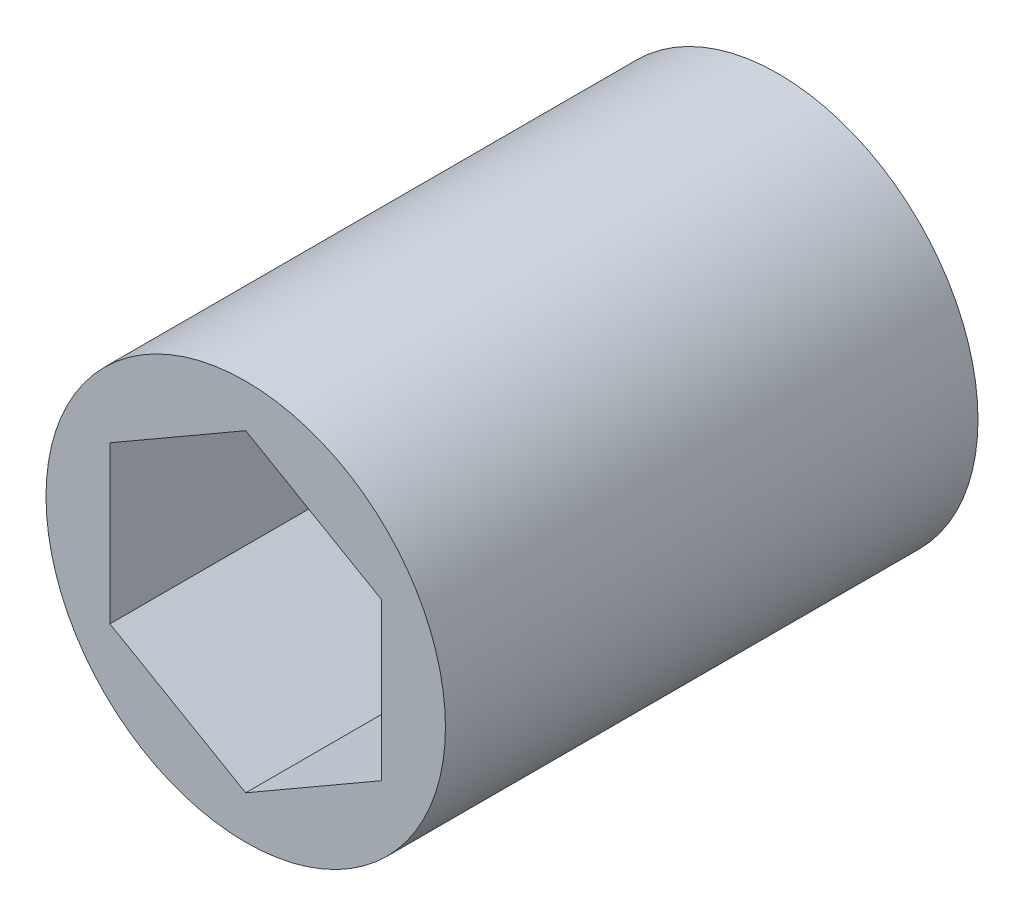
ISO-10303-21;
HEADER;
FILE_DESCRIPTION(('STEP AP214'),'2;1');
FILE_NAME('part.step','',(''),(''),'','','');
FILE_SCHEMA(('AUTOMOTIVE_DESIGN { 1 0 10303 214 1 1 1 1 }'));
ENDSEC;
DATA;
#1=APPLICATION_CONTEXT('core data for automotive mechanical design processes');
#2=APPLICATION_PROTOCOL_DEFINITION('international standard','automotive_design',2000,#1);
#3=PRODUCT_CONTEXT('',#1,'mechanical');
#4=PRODUCT('Part','Part','',(#3));
#5=PRODUCT_RELATED_PRODUCT_CATEGORY('part','',(#4));
#6=PRODUCT_DEFINITION_FORMATION('','',#4);
#7=PRODUCT_DEFINITION_CONTEXT('part definition',#1,'design');
#8=PRODUCT_DEFINITION('design','',#6,#7);
#9=PRODUCT_DEFINITION_SHAPE('','',#8);
#10=(LENGTH_UNIT() NAMED_UNIT(*) SI_UNIT(.MILLI.,.METRE.));
#11=(NAMED_UNIT(*) PLANE_ANGLE_UNIT() SI_UNIT($,.RADIAN.));
#12=(NAMED_UNIT(*) SI_UNIT($,.STERADIAN.) SOLID_ANGLE_UNIT());
#13=UNCERTAINTY_MEASURE_WITH_UNIT(LENGTH_MEASURE(1.E-05),#10,'distance_accuracy_value','');
#14=(GEOMETRIC_REPRESENTATION_CONTEXT(3) GLOBAL_UNCERTAINTY_ASSIGNED_CONTEXT((#13)) GLOBAL_UNIT_ASSIGNED_CONTEXT((#10,
#11,#12)) REPRESENTATION_CONTEXT('',''));
#15=CARTESIAN_POINT('',(0.,0.,0.));
#16=DIRECTION('',(0.,0.,1.));
#17=DIRECTION('',(1.,0.,0.));
#18=AXIS2_PLACEMENT_3D('',#15,#16,#17);
#19=CARTESIAN_POINT('',(0.,0.,12.7));
#20=DIRECTION('',(0.,0.,1.));
#21=DIRECTION('',(1.,0.,0.));
#22=AXIS2_PLACEMENT_3D('',#19,#20,#21);
#23=PLANE('',#22);
#24=CARTESIAN_POINT('',(0.,0.,12.7));
#25=DIRECTION('',(0.,0.,1.));
#26=DIRECTION('',(1.,0.,0.));
#27=AXIS2_PLACEMENT_3D('',#24,#25,#26);
#28=CIRCLE('',#27,9.525);
#29=CARTESIAN_POINT('',(9.525,0.,12.7));
#30=VERTEX_POINT('',#29);
#31=EDGE_CURVE('E11',#30,#30,#28,.T.);
#32=ORIENTED_EDGE('',*,*,#31,.T.);
#33=EDGE_LOOP('',(#32));
#34=FACE_BOUND('',#33,.T.);
#35=DIRECTION('',(-0.866025403784439,-0.5,0.));
#36=VECTOR('',#35,1.);
#37=CARTESIAN_POINT('',(0.,7.47899538708241,12.7));
#38=LINE('',#37,#36);
#39=CARTESIAN_POINT('',(0.,7.47899538708241,12.7));
#40=VERTEX_POINT('',#39);
#41=CARTESIAN_POINT('',(-6.477,3.73949769354121,12.7));
#42=VERTEX_POINT('',#41);
#43=EDGE_CURVE('E108',#40,#42,#38,.T.);
#44=ORIENTED_EDGE('',*,*,#43,.F.);
#45=DIRECTION('',(-0.866025403784439,0.5,0.));
#46=VECTOR('',#45,1.);
#47=CARTESIAN_POINT('',(6.477,3.73949769354121,12.7));
#48=LINE('',#47,#46);
#49=CARTESIAN_POINT('',(6.477,3.73949769354121,12.7));
#50=VERTEX_POINT('',#49);
#51=EDGE_CURVE('E99',#50,#40,#48,.T.);
#52=ORIENTED_EDGE('',*,*,#51,.F.);
#53=DIRECTION('',(0.,1.,0.));
#54=VECTOR('',#53,1.);
#55=CARTESIAN_POINT('',(6.477,-3.73949769354121,12.7));
#56=LINE('',#55,#54);
#57=CARTESIAN_POINT('',(6.477,-3.73949769354121,12.7));
#58=VERTEX_POINT('',#57);
#59=EDGE_CURVE('E133',#58,#50,#56,.T.);
#60=ORIENTED_EDGE('',*,*,#59,.F.);
#61=DIRECTION('',(0.866025403784439,0.5,0.));
#62=VECTOR('',#61,1.);
#63=CARTESIAN_POINT('',(0.,-7.47899538708241,12.7));
#64=LINE('',#63,#62);
#65=CARTESIAN_POINT('',(0.,-7.47899538708241,12.7));
#66=VERTEX_POINT('',#65);
#67=EDGE_CURVE('E130',#66,#58,#64,.T.);
#68=ORIENTED_EDGE('',*,*,#67,.F.);
#69=DIRECTION('',(0.866025403784439,-0.5,0.));
#70=VECTOR('',#69,1.);
#71=CARTESIAN_POINT('',(-6.477,-3.73949769354121,12.7));
#72=LINE('',#71,#70);
#73=CARTESIAN_POINT('',(-6.477,-3.73949769354121,12.7));
#74=VERTEX_POINT('',#73);
#75=EDGE_CURVE('E125',#74,#66,#72,.T.);
#76=ORIENTED_EDGE('',*,*,#75,.F.);
#77=DIRECTION('',(0.,-1.,0.));
#78=VECTOR('',#77,1.);
#79=CARTESIAN_POINT('',(-6.477,3.73949769354121,12.7));
#80=LINE('',#79,#78);
#81=EDGE_CURVE('E121',#42,#74,#80,.T.);
#82=ORIENTED_EDGE('',*,*,#81,.F.);
#83=EDGE_LOOP('',(#44,#52,#60,#68,#76,#82));
#84=FACE_BOUND('',#83,.T.);
#85=ADVANCED_FACE('F45',(#34,#84),#23,.T.);
#86=CARTESIAN_POINT('',(0.,0.,-12.7));
#87=DIRECTION('',(0.,0.,1.));
#88=DIRECTION('',(1.,0.,0.));
#89=AXIS2_PLACEMENT_3D('',#86,#87,#88);
#90=PLANE('',#89);
#91=CARTESIAN_POINT('',(0.,0.,-12.7));
#92=DIRECTION('',(0.,0.,1.));
#93=DIRECTION('',(1.,0.,0.));
#94=AXIS2_PLACEMENT_3D('',#91,#92,#93);
#95=CIRCLE('',#94,9.525);
#96=CARTESIAN_POINT('',(9.525,0.,-12.7));
#97=VERTEX_POINT('',#96);
#98=EDGE_CURVE('E49',#97,#97,#95,.T.);
#99=ORIENTED_EDGE('',*,*,#98,.F.);
#100=EDGE_LOOP('',(#99));
#101=FACE_BOUND('',#100,.T.);
#102=DIRECTION('',(-0.866025403784439,0.5,0.));
#103=VECTOR('',#102,1.);
#104=CARTESIAN_POINT('',(6.477,3.73949769354121,-12.7));
#105=LINE('',#104,#103);
#106=CARTESIAN_POINT('',(6.477,3.73949769354121,-12.7));
#107=VERTEX_POINT('',#106);
#108=CARTESIAN_POINT('',(0.,7.47899538708241,-12.7));
#109=VERTEX_POINT('',#108);
#110=EDGE_CURVE('E69',#107,#109,#105,.T.);
#111=ORIENTED_EDGE('',*,*,#110,.T.);
#112=DIRECTION('',(-0.866025403784439,-0.5,0.));
#113=VECTOR('',#112,1.);
#114=CARTESIAN_POINT('',(0.,7.47899538708241,-12.7));
#115=LINE('',#114,#113);
#116=CARTESIAN_POINT('',(-6.477,3.73949769354121,-12.7));
#117=VERTEX_POINT('',#116);
#118=EDGE_CURVE('E115',#109,#117,#115,.T.);
#119=ORIENTED_EDGE('',*,*,#118,.T.);
#120=DIRECTION('',(0.,-1.,0.));
#121=VECTOR('',#120,1.);
#122=CARTESIAN_POINT('',(-6.477,3.73949769354121,-12.7));
#123=LINE('',#122,#121);
#124=CARTESIAN_POINT('',(-6.477,-3.73949769354121,-12.7));
#125=VERTEX_POINT('',#124);
#126=EDGE_CURVE('E140',#117,#125,#123,.T.);
#127=ORIENTED_EDGE('',*,*,#126,.T.);
#128=DIRECTION('',(0.866025403784439,-0.5,0.));
#129=VECTOR('',#128,1.);
#130=CARTESIAN_POINT('',(-6.477,-3.73949769354121,-12.7));
#131=LINE('',#130,#129);
#132=CARTESIAN_POINT('',(0.,-7.47899538708241,-12.7));
#133=VERTEX_POINT('',#132);
#134=EDGE_CURVE('E144',#125,#133,#131,.T.);
#135=ORIENTED_EDGE('',*,*,#134,.T.);
#136=DIRECTION('',(0.866025403784439,0.5,0.));
#137=VECTOR('',#136,1.);
#138=CARTESIAN_POINT('',(0.,-7.47899538708241,-12.7));
#139=LINE('',#138,#137);
#140=CARTESIAN_POINT('',(6.477,-3.73949769354121,-12.7));
#141=VERTEX_POINT('',#140);
#142=EDGE_CURVE('E148',#133,#141,#139,.T.);
#143=ORIENTED_EDGE('',*,*,#142,.T.);
#144=DIRECTION('',(0.,1.,0.));
#145=VECTOR('',#144,1.);
#146=CARTESIAN_POINT('',(6.477,-3.73949769354121,-12.7));
#147=LINE('',#146,#145);
#148=EDGE_CURVE('E109',#141,#107,#147,.T.);
#149=ORIENTED_EDGE('',*,*,#148,.T.);
#150=EDGE_LOOP('',(#111,#119,#127,#135,#143,#149));
#151=FACE_BOUND('',#150,.T.);
#152=ADVANCED_FACE('F172',(#101,#151),#90,.F.);
#153=CARTESIAN_POINT('',(0.,0.,12.7));
#154=DIRECTION('',(0.,0.,-1.));
#155=DIRECTION('',(-1.,0.,0.));
#156=AXIS2_PLACEMENT_3D('',#153,#154,#155);
#157=CYLINDRICAL_SURFACE('',#156,9.525);
#158=ORIENTED_EDGE('',*,*,#31,.F.);
#159=EDGE_LOOP('',(#158));
#160=FACE_BOUND('',#159,.T.);
#161=ORIENTED_EDGE('',*,*,#98,.T.);
#162=EDGE_LOOP('',(#161));
#163=FACE_BOUND('',#162,.T.);
#164=ADVANCED_FACE('F47',(#160,#163),#157,.T.);
#165=CARTESIAN_POINT('',(6.477,3.73949769354121,12.7));
#166=DIRECTION('',(-0.5,-0.866025403784439,0.));
#167=DIRECTION('',(0.866025403784439,-0.5,0.));
#168=AXIS2_PLACEMENT_3D('',#165,#166,#167);
#169=PLANE('',#168);
#170=ORIENTED_EDGE('',*,*,#110,.F.);
#171=DIRECTION('',(0.,0.,-1.));
#172=VECTOR('',#171,1.);
#173=CARTESIAN_POINT('',(6.477,3.73949769354121,12.7));
#174=LINE('',#173,#172);
#175=EDGE_CURVE('E103',#50,#107,#174,.T.);
#176=ORIENTED_EDGE('',*,*,#175,.F.);
#177=ORIENTED_EDGE('',*,*,#51,.T.);
#178=DIRECTION('',(0.,0.,-1.));
#179=VECTOR('',#178,1.);
#180=CARTESIAN_POINT('',(0.,7.47899538708241,12.7));
#181=LINE('',#180,#179);
#182=EDGE_CURVE('E102',#40,#109,#181,.T.);
#183=ORIENTED_EDGE('',*,*,#182,.T.);
#184=EDGE_LOOP('',(#170,#176,#177,#183));
#185=FACE_BOUND('',#184,.T.);
#186=ADVANCED_FACE('F101',(#185),#169,.T.);
#187=CARTESIAN_POINT('',(0.,7.47899538708241,12.7));
#188=DIRECTION('',(0.5,-0.866025403784439,0.));
#189=DIRECTION('',(0.866025403784439,0.5,0.));
#190=AXIS2_PLACEMENT_3D('',#187,#188,#189);
#191=PLANE('',#190);
#192=ORIENTED_EDGE('',*,*,#118,.F.);
#193=ORIENTED_EDGE('',*,*,#182,.F.);
#194=ORIENTED_EDGE('',*,*,#43,.T.);
#195=DIRECTION('',(0.,0.,-1.));
#196=VECTOR('',#195,1.);
#197=CARTESIAN_POINT('',(-6.477,3.73949769354121,12.7));
#198=LINE('',#197,#196);
#199=EDGE_CURVE('E117',#42,#117,#198,.T.);
#200=ORIENTED_EDGE('',*,*,#199,.T.);
#201=EDGE_LOOP('',(#192,#193,#194,#200));
#202=FACE_BOUND('',#201,.T.);
#203=ADVANCED_FACE('F112',(#202),#191,.T.);
#204=CARTESIAN_POINT('',(-6.477,3.73949769354121,12.7));
#205=DIRECTION('',(1.,0.,0.));
#206=DIRECTION('',(0.,1.,0.));
#207=AXIS2_PLACEMENT_3D('',#204,#205,#206);
#208=PLANE('',#207);
#209=ORIENTED_EDGE('',*,*,#126,.F.);
#210=ORIENTED_EDGE('',*,*,#199,.F.);
#211=ORIENTED_EDGE('',*,*,#81,.T.);
#212=DIRECTION('',(0.,0.,-1.));
#213=VECTOR('',#212,1.);
#214=CARTESIAN_POINT('',(-6.477,-3.73949769354121,12.7));
#215=LINE('',#214,#213);
#216=EDGE_CURVE('E162',#74,#125,#215,.T.);
#217=ORIENTED_EDGE('',*,*,#216,.T.);
#218=EDGE_LOOP('',(#209,#210,#211,#217));
#219=FACE_BOUND('',#218,.T.);
#220=ADVANCED_FACE('F168',(#219),#208,.T.);
#221=CARTESIAN_POINT('',(-6.477,-3.73949769354121,12.7));
#222=DIRECTION('',(0.5,0.866025403784439,0.));
#223=DIRECTION('',(-0.866025403784439,0.5,0.));
#224=AXIS2_PLACEMENT_3D('',#221,#222,#223);
#225=PLANE('',#224);
#226=ORIENTED_EDGE('',*,*,#134,.F.);
#227=ORIENTED_EDGE('',*,*,#216,.F.);
#228=ORIENTED_EDGE('',*,*,#75,.T.);
#229=DIRECTION('',(0.,0.,-1.));
#230=VECTOR('',#229,1.);
#231=CARTESIAN_POINT('',(0.,-7.47899538708241,12.7));
#232=LINE('',#231,#230);
#233=EDGE_CURVE('E159',#66,#133,#232,.T.);
#234=ORIENTED_EDGE('',*,*,#233,.T.);
#235=EDGE_LOOP('',(#226,#227,#228,#234));
#236=FACE_BOUND('',#235,.T.);
#237=ADVANCED_FACE('F180',(#236),#225,.T.);
#238=CARTESIAN_POINT('',(0.,-7.47899538708241,12.7));
#239=DIRECTION('',(-0.5,0.866025403784439,0.));
#240=DIRECTION('',(-0.866025403784439,-0.5,0.));
#241=AXIS2_PLACEMENT_3D('',#238,#239,#240);
#242=PLANE('',#241);
#243=ORIENTED_EDGE('',*,*,#142,.F.);
#244=ORIENTED_EDGE('',*,*,#233,.F.);
#245=ORIENTED_EDGE('',*,*,#67,.T.);
#246=DIRECTION('',(0.,0.,-1.));
#247=VECTOR('',#246,1.);
#248=CARTESIAN_POINT('',(6.477,-3.73949769354121,12.7));
#249=LINE('',#248,#247);
#250=EDGE_CURVE('E61',#58,#141,#249,.T.);
#251=ORIENTED_EDGE('',*,*,#250,.T.);
#252=EDGE_LOOP('',(#243,#244,#245,#251));
#253=FACE_BOUND('',#252,.T.);
#254=ADVANCED_FACE('F178',(#253),#242,.T.);
#255=CARTESIAN_POINT('',(6.477,-3.73949769354121,12.7));
#256=DIRECTION('',(-1.,0.,0.));
#257=DIRECTION('',(0.,0.,1.));
#258=AXIS2_PLACEMENT_3D('',#255,#256,#257);
#259=PLANE('',#258);
#260=ORIENTED_EDGE('',*,*,#148,.F.);
#261=ORIENTED_EDGE('',*,*,#250,.F.);
#262=ORIENTED_EDGE('',*,*,#59,.T.);
#263=ORIENTED_EDGE('',*,*,#175,.T.);
#264=EDGE_LOOP('',(#260,#261,#262,#263));
#265=FACE_BOUND('',#264,.T.);
#266=ADVANCED_FACE('F174',(#265),#259,.T.);
#267=CLOSED_SHELL('',(#85,#152,#164,#186,#203,#220,#237,#254,#266));
#268=MANIFOLD_SOLID_BREP('B2',#267);
#269=ADVANCED_BREP_SHAPE_REPRESENTATION('',(#18,#268),#14);
#270=SHAPE_DEFINITION_REPRESENTATION(#9,#269);
ENDSEC;
END-ISO-10303-21;
